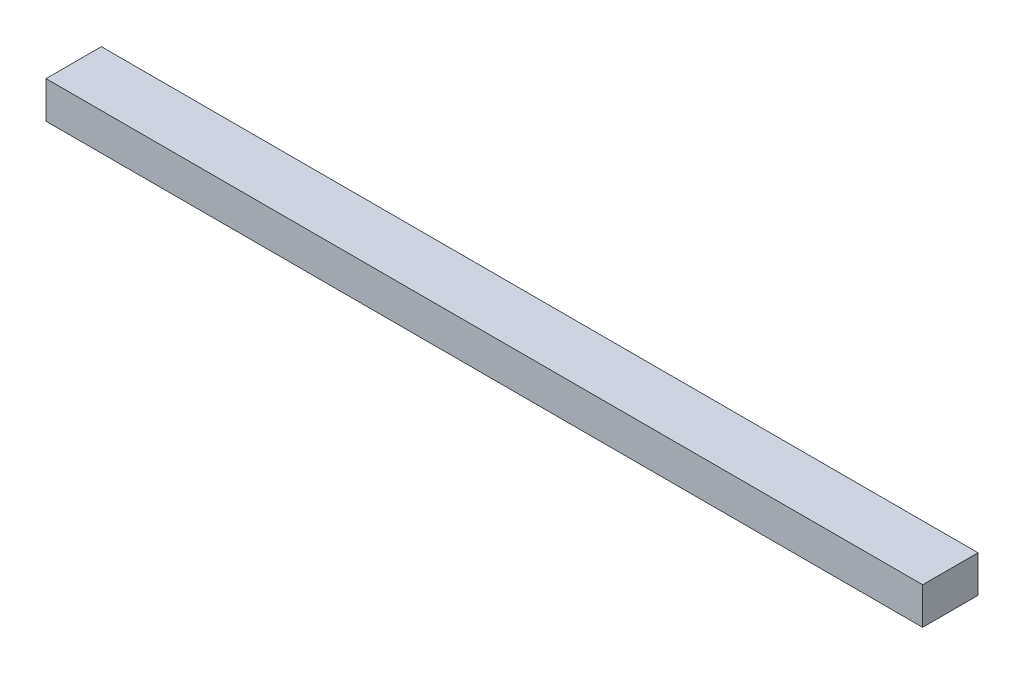
ISO-10303-21;
HEADER;
FILE_DESCRIPTION(('STEP AP214'),'2;1');
FILE_NAME('part.step','',(''),(''),'','','');
FILE_SCHEMA(('AUTOMOTIVE_DESIGN { 1 0 10303 214 1 1 1 1 }'));
ENDSEC;
DATA;
#1=APPLICATION_CONTEXT('core data for automotive mechanical design processes');
#2=APPLICATION_PROTOCOL_DEFINITION('international standard','automotive_design',2000,#1);
#3=PRODUCT_CONTEXT('',#1,'mechanical');
#4=PRODUCT('Part','Part','',(#3));
#5=PRODUCT_RELATED_PRODUCT_CATEGORY('part','',(#4));
#6=PRODUCT_DEFINITION_FORMATION('','',#4);
#7=PRODUCT_DEFINITION_CONTEXT('part definition',#1,'design');
#8=PRODUCT_DEFINITION('design','',#6,#7);
#9=PRODUCT_DEFINITION_SHAPE('','',#8);
#10=(LENGTH_UNIT() NAMED_UNIT(*) SI_UNIT(.MILLI.,.METRE.));
#11=(NAMED_UNIT(*) PLANE_ANGLE_UNIT() SI_UNIT($,.RADIAN.));
#12=(NAMED_UNIT(*) SI_UNIT($,.STERADIAN.) SOLID_ANGLE_UNIT());
#13=UNCERTAINTY_MEASURE_WITH_UNIT(LENGTH_MEASURE(1.E-05),#10,'distance_accuracy_value','');
#14=(GEOMETRIC_REPRESENTATION_CONTEXT(3) GLOBAL_UNCERTAINTY_ASSIGNED_CONTEXT((#13)) GLOBAL_UNIT_ASSIGNED_CONTEXT((#10,
#11,#12)) REPRESENTATION_CONTEXT('',''));
#15=CARTESIAN_POINT('',(0.,0.,0.));
#16=DIRECTION('',(0.,0.,1.));
#17=DIRECTION('',(1.,0.,0.));
#18=AXIS2_PLACEMENT_3D('',#15,#16,#17);
#19=CARTESIAN_POINT('',(603.25,50.8,38.1));
#20=DIRECTION('',(-1.,0.,0.));
#21=DIRECTION('',(0.,0.,1.));
#22=AXIS2_PLACEMENT_3D('',#19,#20,#21);
#23=PLANE('',#22);
#24=DIRECTION('',(0.,0.,-1.));
#25=VECTOR('',#24,1.);
#26=CARTESIAN_POINT('',(603.25,0.,38.1));
#27=LINE('',#26,#25);
#28=CARTESIAN_POINT('',(603.25,0.,38.1));
#29=VERTEX_POINT('',#28);
#30=CARTESIAN_POINT('',(603.25,0.,-38.1));
#31=VERTEX_POINT('',#30);
#32=EDGE_CURVE('E107',#29,#31,#27,.T.);
#33=ORIENTED_EDGE('',*,*,#32,.T.);
#34=DIRECTION('',(0.,-1.,0.));
#35=VECTOR('',#34,1.);
#36=CARTESIAN_POINT('',(603.25,50.8,-38.1));
#37=LINE('',#36,#35);
#38=CARTESIAN_POINT('',(603.25,50.8,-38.1));
#39=VERTEX_POINT('',#38);
#40=EDGE_CURVE('E11',#39,#31,#37,.T.);
#41=ORIENTED_EDGE('',*,*,#40,.F.);
#42=DIRECTION('',(0.,0.,-1.));
#43=VECTOR('',#42,1.);
#44=CARTESIAN_POINT('',(603.25,50.8,38.1));
#45=LINE('',#44,#43);
#46=CARTESIAN_POINT('',(603.25,50.8,38.1));
#47=VERTEX_POINT('',#46);
#48=EDGE_CURVE('E91',#47,#39,#45,.T.);
#49=ORIENTED_EDGE('',*,*,#48,.F.);
#50=DIRECTION('',(0.,-1.,0.));
#51=VECTOR('',#50,1.);
#52=CARTESIAN_POINT('',(603.25,50.8,38.1));
#53=LINE('',#52,#51);
#54=EDGE_CURVE('E103',#47,#29,#53,.T.);
#55=ORIENTED_EDGE('',*,*,#54,.T.);
#56=EDGE_LOOP('',(#33,#41,#49,#55));
#57=FACE_BOUND('',#56,.T.);
#58=ADVANCED_FACE('F39',(#57),#23,.F.);
#59=CARTESIAN_POINT('',(-603.25,50.8,-38.1));
#60=DIRECTION('',(0.,0.,1.));
#61=DIRECTION('',(1.,0.,0.));
#62=AXIS2_PLACEMENT_3D('',#59,#60,#61);
#63=PLANE('',#62);
#64=DIRECTION('',(-1.,0.,0.));
#65=VECTOR('',#64,1.);
#66=CARTESIAN_POINT('',(-603.25,0.,-38.1));
#67=LINE('',#66,#65);
#68=CARTESIAN_POINT('',(-603.25,0.,-38.1));
#69=VERTEX_POINT('',#68);
#70=EDGE_CURVE('E96',#31,#69,#67,.T.);
#71=ORIENTED_EDGE('',*,*,#70,.T.);
#72=DIRECTION('',(0.,-1.,0.));
#73=VECTOR('',#72,1.);
#74=CARTESIAN_POINT('',(-603.25,50.8,-38.1));
#75=LINE('',#74,#73);
#76=CARTESIAN_POINT('',(-603.25,50.8,-38.1));
#77=VERTEX_POINT('',#76);
#78=EDGE_CURVE('E48',#77,#69,#75,.T.);
#79=ORIENTED_EDGE('',*,*,#78,.F.);
#80=DIRECTION('',(-1.,0.,0.));
#81=VECTOR('',#80,1.);
#82=CARTESIAN_POINT('',(-603.25,50.8,-38.1));
#83=LINE('',#82,#81);
#84=EDGE_CURVE('E86',#39,#77,#83,.T.);
#85=ORIENTED_EDGE('',*,*,#84,.F.);
#86=ORIENTED_EDGE('',*,*,#40,.T.);
#87=EDGE_LOOP('',(#71,#79,#85,#86));
#88=FACE_BOUND('',#87,.T.);
#89=ADVANCED_FACE('F95',(#88),#63,.F.);
#90=CARTESIAN_POINT('',(-603.25,50.8,38.1));
#91=DIRECTION('',(1.,0.,0.));
#92=DIRECTION('',(0.,0.,-1.));
#93=AXIS2_PLACEMENT_3D('',#90,#91,#92);
#94=PLANE('',#93);
#95=DIRECTION('',(0.,0.,1.));
#96=VECTOR('',#95,1.);
#97=CARTESIAN_POINT('',(-603.25,0.,38.1));
#98=LINE('',#97,#96);
#99=CARTESIAN_POINT('',(-603.25,0.,38.1));
#100=VERTEX_POINT('',#99);
#101=EDGE_CURVE('E73',#69,#100,#98,.T.);
#102=ORIENTED_EDGE('',*,*,#101,.T.);
#103=DIRECTION('',(0.,-1.,0.));
#104=VECTOR('',#103,1.);
#105=CARTESIAN_POINT('',(-603.25,50.8,38.1));
#106=LINE('',#105,#104);
#107=CARTESIAN_POINT('',(-603.25,50.8,38.1));
#108=VERTEX_POINT('',#107);
#109=EDGE_CURVE('E98',#108,#100,#106,.T.);
#110=ORIENTED_EDGE('',*,*,#109,.F.);
#111=DIRECTION('',(0.,0.,1.));
#112=VECTOR('',#111,1.);
#113=CARTESIAN_POINT('',(-603.25,50.8,38.1));
#114=LINE('',#113,#112);
#115=EDGE_CURVE('E89',#77,#108,#114,.T.);
#116=ORIENTED_EDGE('',*,*,#115,.F.);
#117=ORIENTED_EDGE('',*,*,#78,.T.);
#118=EDGE_LOOP('',(#102,#110,#116,#117));
#119=FACE_BOUND('',#118,.T.);
#120=ADVANCED_FACE('F99',(#119),#94,.F.);
#121=CARTESIAN_POINT('',(-603.25,50.8,38.1));
#122=DIRECTION('',(0.,0.,-1.));
#123=DIRECTION('',(-1.,0.,0.));
#124=AXIS2_PLACEMENT_3D('',#121,#122,#123);
#125=PLANE('',#124);
#126=DIRECTION('',(1.,0.,0.));
#127=VECTOR('',#126,1.);
#128=CARTESIAN_POINT('',(-603.25,0.,38.1));
#129=LINE('',#128,#127);
#130=EDGE_CURVE('E79',#100,#29,#129,.T.);
#131=ORIENTED_EDGE('',*,*,#130,.T.);
#132=ORIENTED_EDGE('',*,*,#54,.F.);
#133=DIRECTION('',(1.,0.,0.));
#134=VECTOR('',#133,1.);
#135=CARTESIAN_POINT('',(-603.25,50.8,38.1));
#136=LINE('',#135,#134);
#137=EDGE_CURVE('E56',#108,#47,#136,.T.);
#138=ORIENTED_EDGE('',*,*,#137,.F.);
#139=ORIENTED_EDGE('',*,*,#109,.T.);
#140=EDGE_LOOP('',(#131,#132,#138,#139));
#141=FACE_BOUND('',#140,.T.);
#142=ADVANCED_FACE('F120',(#141),#125,.F.);
#143=CARTESIAN_POINT('',(0.,50.8,0.));
#144=DIRECTION('',(0.,-1.,0.));
#145=DIRECTION('',(0.,0.,-1.));
#146=AXIS2_PLACEMENT_3D('',#143,#144,#145);
#147=PLANE('',#146);
#148=ORIENTED_EDGE('',*,*,#48,.T.);
#149=ORIENTED_EDGE('',*,*,#84,.T.);
#150=ORIENTED_EDGE('',*,*,#115,.T.);
#151=ORIENTED_EDGE('',*,*,#137,.T.);
#152=EDGE_LOOP('',(#148,#149,#150,#151));
#153=FACE_BOUND('',#152,.T.);
#154=ADVANCED_FACE('F87',(#153),#147,.F.);
#155=CARTESIAN_POINT('',(0.,0.,0.));
#156=DIRECTION('',(0.,-1.,0.));
#157=DIRECTION('',(0.,0.,-1.));
#158=AXIS2_PLACEMENT_3D('',#155,#156,#157);
#159=PLANE('',#158);
#160=ORIENTED_EDGE('',*,*,#32,.F.);
#161=ORIENTED_EDGE('',*,*,#130,.F.);
#162=ORIENTED_EDGE('',*,*,#101,.F.);
#163=ORIENTED_EDGE('',*,*,#70,.F.);
#164=EDGE_LOOP('',(#160,#161,#162,#163));
#165=FACE_BOUND('',#164,.T.);
#166=ADVANCED_FACE('F123',(#165),#159,.T.);
#167=CLOSED_SHELL('',(#58,#89,#120,#142,#154,#166));
#168=MANIFOLD_SOLID_BREP('B2',#167);
#169=ADVANCED_BREP_SHAPE_REPRESENTATION('',(#18,#168),#14);
#170=SHAPE_DEFINITION_REPRESENTATION(#9,#169);
ENDSEC;
END-ISO-10303-21;
